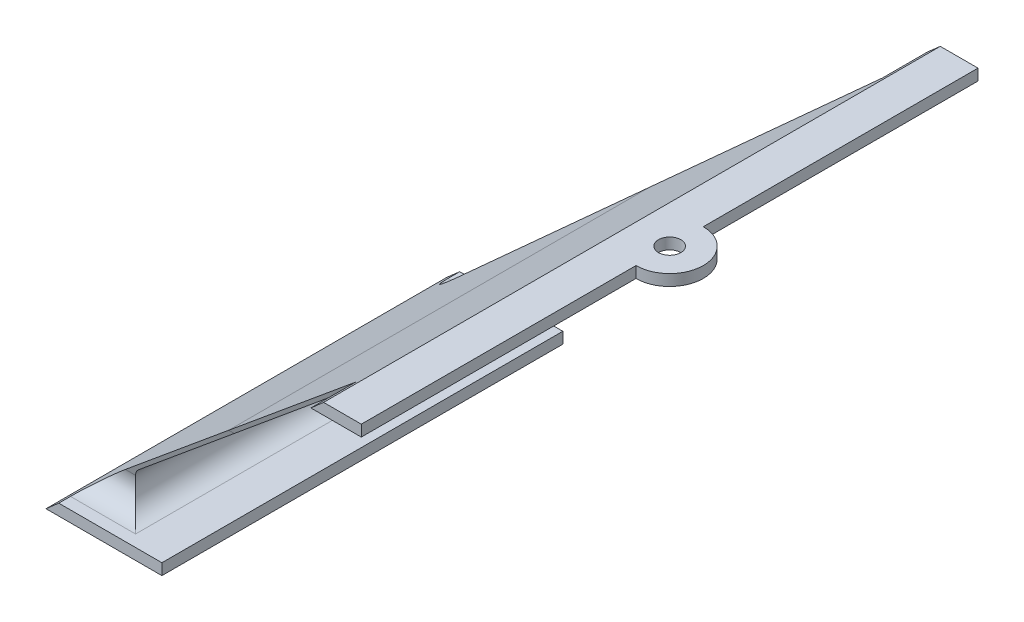
ISO-10303-21;
HEADER;
FILE_DESCRIPTION(('STEP AP214'),'2;1');
FILE_NAME('part.step','',(''),(''),'','','');
FILE_SCHEMA(('AUTOMOTIVE_DESIGN { 1 0 10303 214 1 1 1 1 }'));
ENDSEC;
DATA;
#1=APPLICATION_CONTEXT('core data for automotive mechanical design processes');
#2=APPLICATION_PROTOCOL_DEFINITION('international standard','automotive_design',2000,#1);
#3=PRODUCT_CONTEXT('',#1,'mechanical');
#4=PRODUCT('Part','Part','',(#3));
#5=PRODUCT_RELATED_PRODUCT_CATEGORY('part','',(#4));
#6=PRODUCT_DEFINITION_FORMATION('','',#4);
#7=PRODUCT_DEFINITION_CONTEXT('part definition',#1,'design');
#8=PRODUCT_DEFINITION('design','',#6,#7);
#9=PRODUCT_DEFINITION_SHAPE('','',#8);
#10=(LENGTH_UNIT() NAMED_UNIT(*) SI_UNIT(.MILLI.,.METRE.));
#11=(NAMED_UNIT(*) PLANE_ANGLE_UNIT() SI_UNIT($,.RADIAN.));
#12=(NAMED_UNIT(*) SI_UNIT($,.STERADIAN.) SOLID_ANGLE_UNIT());
#13=UNCERTAINTY_MEASURE_WITH_UNIT(LENGTH_MEASURE(1.E-05),#10,'distance_accuracy_value','');
#14=(GEOMETRIC_REPRESENTATION_CONTEXT(3) GLOBAL_UNCERTAINTY_ASSIGNED_CONTEXT((#13)) GLOBAL_UNIT_ASSIGNED_CONTEXT((#10,
#11,#12)) REPRESENTATION_CONTEXT('',''));
#15=CARTESIAN_POINT('',(0.,0.,0.));
#16=DIRECTION('',(0.,0.,1.));
#17=DIRECTION('',(1.,0.,0.));
#18=AXIS2_PLACEMENT_3D('',#15,#16,#17);
#19=CARTESIAN_POINT('',(114.106988188976,-70.5249999999999,141.072171653543));
#20=DIRECTION('',(-0.660159046311805,0.751125844031936,0.));
#21=DIRECTION('',(-0.751125844031936,-0.660159046311805,0.));
#22=AXIS2_PLACEMENT_3D('',#19,#20,#21);
#23=PLANE('',#22);
#24=DIRECTION('',(-0.733434694729322,-0.644610423741342,-0.215756692066117));
#25=VECTOR('',#24,1.);
#26=CARTESIAN_POINT('',(63.7448594836928,-114.787908965889,126.256992643134));
#27=LINE('',#26,#25);
#28=CARTESIAN_POINT('',(194.35,0.,164.6775));
#29=VERTEX_POINT('',#28);
#30=CARTESIAN_POINT('',(114.106988188976,-70.5249999999999,141.072171653543));
#31=VERTEX_POINT('',#30);
#32=EDGE_CURVE('E14',#29,#31,#27,.T.);
#33=ORIENTED_EDGE('',*,*,#32,.F.);
#34=DIRECTION('',(0.,0.,1.));
#35=VECTOR('',#34,1.);
#36=CARTESIAN_POINT('',(194.35,0.,-90.2725000000001));
#37=LINE('',#36,#35);
#38=CARTESIAN_POINT('',(194.35,0.,184.6775));
#39=VERTEX_POINT('',#38);
#40=EDGE_CURVE('E86',#29,#39,#37,.T.);
#41=ORIENTED_EDGE('',*,*,#40,.T.);
#42=DIRECTION('',(0.751125844031936,0.660159046311805,0.));
#43=VECTOR('',#42,1.);
#44=CARTESIAN_POINT('',(87.1789795794293,-94.19183109628,184.6775));
#45=LINE('',#44,#43);
#46=CARTESIAN_POINT('',(200.038976377953,5.,184.6775));
#47=VERTEX_POINT('',#46);
#48=EDGE_CURVE('E176',#39,#47,#45,.T.);
#49=ORIENTED_EDGE('',*,*,#48,.T.);
#50=DIRECTION('',(0.,0.,1.));
#51=VECTOR('',#50,1.);
#52=CARTESIAN_POINT('',(200.038976377953,5.,0.));
#53=LINE('',#52,#51);
#54=CARTESIAN_POINT('',(200.038976377953,5.,-90.2725));
#55=VERTEX_POINT('',#54);
#56=EDGE_CURVE('E214',#55,#47,#53,.T.);
#57=ORIENTED_EDGE('',*,*,#56,.F.);
#58=DIRECTION('',(0.751125844031936,0.660159046311805,0.));
#59=VECTOR('',#58,1.);
#60=CARTESIAN_POINT('',(87.1789795794294,-94.1918310962799,-90.2725));
#61=LINE('',#60,#59);
#62=CARTESIAN_POINT('',(194.35,0.,-90.2725000000001));
#63=VERTEX_POINT('',#62);
#64=EDGE_CURVE('E178',#63,#55,#61,.T.);
#65=ORIENTED_EDGE('',*,*,#64,.F.);
#66=CARTESIAN_POINT('',(194.35,0.,-70.2725));
#67=VERTEX_POINT('',#66);
#68=EDGE_CURVE('E179',#63,#67,#37,.T.);
#69=ORIENTED_EDGE('',*,*,#68,.T.);
#70=DIRECTION('',(-0.733434694729322,-0.644610423741342,0.215756692066118));
#71=VECTOR('',#70,1.);
#72=CARTESIAN_POINT('',(78.6838317749874,-101.658154772156,-36.2466350940566));
#73=LINE('',#72,#71);
#74=CARTESIAN_POINT('',(114.106988188976,-70.5249999999999,-46.6671716535433));
#75=VERTEX_POINT('',#74);
#76=EDGE_CURVE('E92',#67,#75,#73,.T.);
#77=ORIENTED_EDGE('',*,*,#76,.T.);
#78=DIRECTION('',(0.,0.,-1.));
#79=VECTOR('',#78,1.);
#80=CARTESIAN_POINT('',(114.106988188976,-70.5249999999999,392.1275));
#81=LINE('',#80,#79);
#82=EDGE_CURVE('E100',#31,#75,#81,.T.);
#83=ORIENTED_EDGE('',*,*,#82,.F.);
#84=EDGE_LOOP('',(#33,#41,#49,#57,#65,#69,#77,#83));
#85=FACE_BOUND('',#84,.T.);
#86=ADVANCED_FACE('F82',(#85),#23,.T.);
#87=CARTESIAN_POINT('',(0.,-70.5249999999999,0.));
#88=DIRECTION('',(0.,1.,0.));
#89=DIRECTION('',(0.,0.,1.));
#90=AXIS2_PLACEMENT_3D('',#87,#88,#89);
#91=PLANE('',#90);
#92=ORIENTED_EDGE('',*,*,#82,.T.);
#93=DIRECTION('',(-1.,0.,0.));
#94=VECTOR('',#93,1.);
#95=CARTESIAN_POINT('',(0.,-70.5249999999999,-46.6671716535434));
#96=LINE('',#95,#94);
#97=CARTESIAN_POINT('',(116.606988188976,-70.5249999999999,-46.6671716535433));
#98=VERTEX_POINT('',#97);
#99=EDGE_CURVE('E203',#98,#75,#96,.T.);
#100=ORIENTED_EDGE('',*,*,#99,.F.);
#101=DIRECTION('',(0.,0.,-1.));
#102=VECTOR('',#101,1.);
#103=CARTESIAN_POINT('',(116.606988188976,-70.5249999999999,0.));
#104=LINE('',#103,#102);
#105=CARTESIAN_POINT('',(116.606988188976,-70.525,141.072171653543));
#106=VERTEX_POINT('',#105);
#107=EDGE_CURVE('E340',#106,#98,#104,.T.);
#108=ORIENTED_EDGE('',*,*,#107,.F.);
#109=DIRECTION('',(-1.,0.,0.));
#110=VECTOR('',#109,1.);
#111=CARTESIAN_POINT('',(0.,-70.5249999999999,141.072171653543));
#112=LINE('',#111,#110);
#113=EDGE_CURVE('E337',#106,#31,#112,.T.);
#114=ORIENTED_EDGE('',*,*,#113,.T.);
#115=EDGE_LOOP('',(#92,#100,#108,#114));
#116=FACE_BOUND('',#115,.T.);
#117=ADVANCED_FACE('F300',(#116),#91,.F.);
#118=CARTESIAN_POINT('',(0.,-21.1512430220413,-63.1929957607801));
#119=DIRECTION('',(0.,0.317401314466158,0.948291308393763));
#120=DIRECTION('',(0.,-0.948291308393763,0.317401314466158));
#121=AXIS2_PLACEMENT_3D('',#118,#119,#120);
#122=PLANE('',#121);
#123=ORIENTED_EDGE('',*,*,#76,.F.);
#124=DIRECTION('',(-1.,0.,0.));
#125=VECTOR('',#124,1.);
#126=CARTESIAN_POINT('',(-63.5,0.,-70.2725000000001));
#127=LINE('',#126,#125);
#128=CARTESIAN_POINT('',(196.85,0.,-70.2725));
#129=VERTEX_POINT('',#128);
#130=EDGE_CURVE('E193',#129,#67,#127,.T.);
#131=ORIENTED_EDGE('',*,*,#130,.F.);
#132=DIRECTION('',(-0.733434694729322,-0.644610423741342,0.215756692066118));
#133=VECTOR('',#132,1.);
#134=CARTESIAN_POINT('',(196.85,0.,-70.2725));
#135=LINE('',#134,#133);
#136=EDGE_CURVE('E200',#129,#98,#135,.T.);
#137=ORIENTED_EDGE('',*,*,#136,.T.);
#138=ORIENTED_EDGE('',*,*,#99,.T.);
#139=EDGE_LOOP('',(#123,#131,#137,#138));
#140=FACE_BOUND('',#139,.T.);
#141=ADVANCED_FACE('F202',(#140),#122,.F.);
#142=CARTESIAN_POINT('',(85.7891918912163,-97.6105372305572,0.));
#143=DIRECTION('',(-0.660159046311805,0.751125844031936,0.));
#144=DIRECTION('',(-0.751125844031936,-0.660159046311805,0.));
#145=AXIS2_PLACEMENT_3D('',#142,#143,#144);
#146=PLANE('',#145);
#147=DIRECTION('',(-0.733434694729322,-0.644610423741342,-0.215756692066118));
#148=VECTOR('',#147,1.);
#149=CARTESIAN_POINT('',(196.85,0.,164.6775));
#150=LINE('',#149,#148);
#151=CARTESIAN_POINT('',(196.85,0.,164.6775));
#152=VERTEX_POINT('',#151);
#153=EDGE_CURVE('E324',#152,#106,#150,.T.);
#154=ORIENTED_EDGE('',*,*,#153,.T.);
#155=ORIENTED_EDGE('',*,*,#107,.T.);
#156=ORIENTED_EDGE('',*,*,#136,.F.);
#157=DIRECTION('',(0.,0.,-1.));
#158=VECTOR('',#157,1.);
#159=CARTESIAN_POINT('',(196.85,0.,-70.2725));
#160=LINE('',#159,#158);
#161=EDGE_CURVE('E195',#152,#129,#160,.T.);
#162=ORIENTED_EDGE('',*,*,#161,.F.);
#163=EDGE_LOOP('',(#154,#155,#156,#162));
#164=FACE_BOUND('',#163,.T.);
#165=ADVANCED_FACE('F310',(#164),#146,.F.);
#166=CARTESIAN_POINT('',(0.,-49.5661008611077,148.087296729102));
#167=DIRECTION('',(0.,-0.317401314466157,0.948291308393763));
#168=DIRECTION('',(0.,-0.948291308393763,-0.317401314466157));
#169=AXIS2_PLACEMENT_3D('',#166,#167,#168);
#170=PLANE('',#169);
#171=DIRECTION('',(1.,0.,0.));
#172=VECTOR('',#171,1.);
#173=CARTESIAN_POINT('',(-63.5,0.,164.6775));
#174=LINE('',#173,#172);
#175=EDGE_CURVE('E268',#29,#152,#174,.T.);
#176=ORIENTED_EDGE('',*,*,#175,.F.);
#177=ORIENTED_EDGE('',*,*,#32,.T.);
#178=ORIENTED_EDGE('',*,*,#113,.F.);
#179=ORIENTED_EDGE('',*,*,#153,.F.);
#180=EDGE_LOOP('',(#176,#177,#178,#179));
#181=FACE_BOUND('',#180,.T.);
#182=ADVANCED_FACE('F312',(#181),#170,.T.);
#183=CARTESIAN_POINT('',(-1.19463333478565E-13,5.,184.6775));
#184=DIRECTION('',(0.,0.,-1.));
#185=DIRECTION('',(-1.,0.,0.));
#186=AXIS2_PLACEMENT_3D('',#183,#184,#185);
#187=PLANE('',#186);
#188=ORIENTED_EDGE('',*,*,#48,.F.);
#189=DIRECTION('',(1.,0.,0.));
#190=VECTOR('',#189,1.);
#191=CARTESIAN_POINT('',(-1.19463333478565E-13,0.,184.6775));
#192=LINE('',#191,#190);
#193=CARTESIAN_POINT('',(216.85,0.,184.6775));
#194=VERTEX_POINT('',#193);
#195=EDGE_CURVE('E160',#39,#194,#192,.T.);
#196=ORIENTED_EDGE('',*,*,#195,.T.);
#197=DIRECTION('',(0.,-1.,0.));
#198=VECTOR('',#197,1.);
#199=CARTESIAN_POINT('',(216.85,5.,184.6775));
#200=LINE('',#199,#198);
#201=CARTESIAN_POINT('',(216.85,5.,184.6775));
#202=VERTEX_POINT('',#201);
#203=EDGE_CURVE('E266',#202,#194,#200,.T.);
#204=ORIENTED_EDGE('',*,*,#203,.F.);
#205=DIRECTION('',(1.,0.,0.));
#206=VECTOR('',#205,1.);
#207=CARTESIAN_POINT('',(-1.19463333478565E-13,5.,184.6775));
#208=LINE('',#207,#206);
#209=EDGE_CURVE('E177',#47,#202,#208,.T.);
#210=ORIENTED_EDGE('',*,*,#209,.F.);
#211=EDGE_LOOP('',(#188,#196,#204,#210));
#212=FACE_BOUND('',#211,.T.);
#213=ADVANCED_FACE('F84',(#212),#187,.F.);
#214=CARTESIAN_POINT('',(216.85,5.,0.));
#215=DIRECTION('',(1.,0.,0.));
#216=DIRECTION('',(0.,0.,-1.));
#217=AXIS2_PLACEMENT_3D('',#214,#215,#216);
#218=PLANE('',#217);
#219=DIRECTION('',(0.,1.,0.));
#220=VECTOR('',#219,1.);
#221=CARTESIAN_POINT('',(216.85,-33.5410196624969,62.2025));
#222=LINE('',#221,#220);
#223=CARTESIAN_POINT('',(216.85,0.,62.2025));
#224=VERTEX_POINT('',#223);
#225=CARTESIAN_POINT('',(216.85,5.,62.2025));
#226=VERTEX_POINT('',#225);
#227=EDGE_CURVE('E246',#224,#226,#222,.T.);
#228=ORIENTED_EDGE('',*,*,#227,.T.);
#229=DIRECTION('',(0.,0.,1.));
#230=VECTOR('',#229,1.);
#231=CARTESIAN_POINT('',(216.85,5.,0.));
#232=LINE('',#231,#230);
#233=EDGE_CURVE('E219',#226,#202,#232,.T.);
#234=ORIENTED_EDGE('',*,*,#233,.T.);
#235=ORIENTED_EDGE('',*,*,#203,.T.);
#236=DIRECTION('',(0.,0.,1.));
#237=VECTOR('',#236,1.);
#238=CARTESIAN_POINT('',(216.85,0.,0.));
#239=LINE('',#238,#237);
#240=EDGE_CURVE('E167',#224,#194,#239,.T.);
#241=ORIENTED_EDGE('',*,*,#240,.F.);
#242=EDGE_LOOP('',(#228,#234,#235,#241));
#243=FACE_BOUND('',#242,.T.);
#244=ADVANCED_FACE('F289',(#243),#218,.T.);
#245=CARTESIAN_POINT('',(216.85,-33.5410196624969,47.2025));
#246=DIRECTION('',(0.,1.,0.));
#247=DIRECTION('',(0.,0.,1.));
#248=AXIS2_PLACEMENT_3D('',#245,#246,#247);
#249=CYLINDRICAL_SURFACE('',#248,15.);
#250=CARTESIAN_POINT('',(216.85,0.,47.2025));
#251=DIRECTION('',(0.,1.,0.));
#252=DIRECTION('',(0.,0.,1.));
#253=AXIS2_PLACEMENT_3D('',#250,#251,#252);
#254=CIRCLE('',#253,15.);
#255=CARTESIAN_POINT('',(216.85,0.,32.2025));
#256=VERTEX_POINT('',#255);
#257=EDGE_CURVE('E212',#256,#224,#254,.F.);
#258=ORIENTED_EDGE('',*,*,#257,.F.);
#259=DIRECTION('',(0.,1.,0.));
#260=VECTOR('',#259,1.);
#261=CARTESIAN_POINT('',(216.85,-33.5410196624969,32.2025));
#262=LINE('',#261,#260);
#263=CARTESIAN_POINT('',(216.85,5.,32.2025));
#264=VERTEX_POINT('',#263);
#265=EDGE_CURVE('E243',#256,#264,#262,.T.);
#266=ORIENTED_EDGE('',*,*,#265,.T.);
#267=CARTESIAN_POINT('',(216.85,5.,47.2025));
#268=DIRECTION('',(0.,1.,0.));
#269=DIRECTION('',(0.,0.,1.));
#270=AXIS2_PLACEMENT_3D('',#267,#268,#269);
#271=CIRCLE('',#270,15.);
#272=EDGE_CURVE('E205',#226,#264,#271,.T.);
#273=ORIENTED_EDGE('',*,*,#272,.F.);
#274=ORIENTED_EDGE('',*,*,#227,.F.);
#275=EDGE_LOOP('',(#258,#266,#273,#274));
#276=FACE_BOUND('',#275,.T.);
#277=ADVANCED_FACE('F291',(#276),#249,.T.);
#278=ORIENTED_EDGE('',*,*,#265,.F.);
#279=CARTESIAN_POINT('',(216.85,0.,-90.2725));
#280=VERTEX_POINT('',#279);
#281=EDGE_CURVE('E221',#280,#256,#239,.T.);
#282=ORIENTED_EDGE('',*,*,#281,.F.);
#283=DIRECTION('',(0.,-1.,0.));
#284=VECTOR('',#283,1.);
#285=CARTESIAN_POINT('',(216.85,5.,-90.2725));
#286=LINE('',#285,#284);
#287=CARTESIAN_POINT('',(216.85,5.,-90.2725));
#288=VERTEX_POINT('',#287);
#289=EDGE_CURVE('E230',#288,#280,#286,.T.);
#290=ORIENTED_EDGE('',*,*,#289,.F.);
#291=EDGE_CURVE('E235',#288,#264,#232,.T.);
#292=ORIENTED_EDGE('',*,*,#291,.T.);
#293=EDGE_LOOP('',(#278,#282,#290,#292));
#294=FACE_BOUND('',#293,.T.);
#295=ADVANCED_FACE('F264',(#294),#218,.T.);
#296=CARTESIAN_POINT('',(0.,5.,-90.2725000000001));
#297=DIRECTION('',(0.,0.,-1.));
#298=DIRECTION('',(-1.,0.,0.));
#299=AXIS2_PLACEMENT_3D('',#296,#297,#298);
#300=PLANE('',#299);
#301=DIRECTION('',(1.,0.,0.));
#302=VECTOR('',#301,1.);
#303=CARTESIAN_POINT('',(0.,0.,-90.2725000000001));
#304=LINE('',#303,#302);
#305=EDGE_CURVE('E172',#63,#280,#304,.T.);
#306=ORIENTED_EDGE('',*,*,#305,.F.);
#307=ORIENTED_EDGE('',*,*,#64,.T.);
#308=DIRECTION('',(1.,0.,0.));
#309=VECTOR('',#308,1.);
#310=CARTESIAN_POINT('',(0.,5.,-90.2725000000001));
#311=LINE('',#310,#309);
#312=EDGE_CURVE('E218',#55,#288,#311,.T.);
#313=ORIENTED_EDGE('',*,*,#312,.T.);
#314=ORIENTED_EDGE('',*,*,#289,.T.);
#315=EDGE_LOOP('',(#306,#307,#313,#314));
#316=FACE_BOUND('',#315,.T.);
#317=ADVANCED_FACE('F297',(#316),#300,.T.);
#318=CARTESIAN_POINT('',(216.85,-33.5410196624969,47.2025));
#319=DIRECTION('',(0.,1.,0.));
#320=DIRECTION('',(0.,0.,1.));
#321=AXIS2_PLACEMENT_3D('',#318,#319,#320);
#322=CYLINDRICAL_SURFACE('',#321,4.99999999999999);
#323=CARTESIAN_POINT('',(216.85,5.,47.2025));
#324=DIRECTION('',(0.,1.,0.));
#325=DIRECTION('',(0.,0.,1.));
#326=AXIS2_PLACEMENT_3D('',#323,#324,#325);
#327=CIRCLE('',#326,4.99999999999999);
#328=CARTESIAN_POINT('',(216.85,5.,52.2025));
#329=VERTEX_POINT('',#328);
#330=EDGE_CURVE('E209',#329,#329,#327,.T.);
#331=ORIENTED_EDGE('',*,*,#330,.T.);
#332=EDGE_LOOP('',(#331));
#333=FACE_BOUND('',#332,.T.);
#334=CARTESIAN_POINT('',(216.85,0.,47.2025));
#335=DIRECTION('',(0.,1.,0.));
#336=DIRECTION('',(0.,0.,1.));
#337=AXIS2_PLACEMENT_3D('',#334,#335,#336);
#338=CIRCLE('',#337,4.99999999999999);
#339=CARTESIAN_POINT('',(216.85,0.,52.2025));
#340=VERTEX_POINT('',#339);
#341=EDGE_CURVE('E239',#340,#340,#338,.F.);
#342=ORIENTED_EDGE('',*,*,#341,.T.);
#343=EDGE_LOOP('',(#342));
#344=FACE_BOUND('',#343,.T.);
#345=ADVANCED_FACE('F254',(#333,#344),#322,.F.);
#346=CARTESIAN_POINT('',(0.,0.,0.));
#347=DIRECTION('',(0.,1.,0.));
#348=DIRECTION('',(0.,0.,1.));
#349=AXIS2_PLACEMENT_3D('',#346,#347,#348);
#350=PLANE('',#349);
#351=ORIENTED_EDGE('',*,*,#341,.F.);
#352=EDGE_LOOP('',(#351));
#353=FACE_BOUND('',#352,.T.);
#354=ORIENTED_EDGE('',*,*,#68,.F.);
#355=ORIENTED_EDGE('',*,*,#305,.T.);
#356=ORIENTED_EDGE('',*,*,#281,.T.);
#357=ORIENTED_EDGE('',*,*,#257,.T.);
#358=ORIENTED_EDGE('',*,*,#240,.T.);
#359=ORIENTED_EDGE('',*,*,#195,.F.);
#360=ORIENTED_EDGE('',*,*,#40,.F.);
#361=ORIENTED_EDGE('',*,*,#175,.T.);
#362=ORIENTED_EDGE('',*,*,#161,.T.);
#363=ORIENTED_EDGE('',*,*,#130,.T.);
#364=EDGE_LOOP('',(#354,#355,#356,#357,#358,#359,#360,#361,#362,#363));
#365=FACE_BOUND('',#364,.T.);
#366=ADVANCED_FACE('F163',(#353,#365),#350,.F.);
#367=CARTESIAN_POINT('',(0.,5.,0.));
#368=DIRECTION('',(0.,1.,0.));
#369=DIRECTION('',(0.,0.,1.));
#370=AXIS2_PLACEMENT_3D('',#367,#368,#369);
#371=PLANE('',#370);
#372=ORIENTED_EDGE('',*,*,#330,.F.);
#373=EDGE_LOOP('',(#372));
#374=FACE_BOUND('',#373,.T.);
#375=ORIENTED_EDGE('',*,*,#312,.F.);
#376=ORIENTED_EDGE('',*,*,#56,.T.);
#377=ORIENTED_EDGE('',*,*,#209,.T.);
#378=ORIENTED_EDGE('',*,*,#233,.F.);
#379=ORIENTED_EDGE('',*,*,#272,.T.);
#380=ORIENTED_EDGE('',*,*,#291,.F.);
#381=EDGE_LOOP('',(#375,#376,#377,#378,#379,#380));
#382=FACE_BOUND('',#381,.T.);
#383=ADVANCED_FACE('F257',(#374,#382),#371,.T.);
#384=CLOSED_SHELL('',(#86,#117,#141,#165,#182,#213,#244,#277,#295,#317,#345,#366,#383));
#385=MANIFOLD_SOLID_BREP('B2',#384);
#386=CARTESIAN_POINT('',(0.,-70.5249999999999,0.));
#387=DIRECTION('',(0.,1.,0.));
#388=DIRECTION('',(0.,0.,1.));
#389=AXIS2_PLACEMENT_3D('',#386,#387,#388);
#390=PLANE('',#389);
#391=DIRECTION('',(-1.,0.,0.));
#392=VECTOR('',#391,1.);
#393=CARTESIAN_POINT('',(0.,-70.5249999999999,-46.6671716535434));
#394=LINE('',#393,#392);
#395=CARTESIAN_POINT('',(116.606988188976,-70.5249999999999,-46.6671716535433));
#396=VERTEX_POINT('',#395);
#397=CARTESIAN_POINT('',(114.106988188976,-70.5249999999999,-46.6671716535433));
#398=VERTEX_POINT('',#397);
#399=EDGE_CURVE('E646',#396,#398,#394,.T.);
#400=ORIENTED_EDGE('',*,*,#399,.T.);
#401=DIRECTION('',(0.,0.,-1.));
#402=VECTOR('',#401,1.);
#403=CARTESIAN_POINT('',(114.106988188976,-70.5249999999999,392.1275));
#404=LINE('',#403,#402);
#405=CARTESIAN_POINT('',(114.106988188976,-70.5249999999999,141.072171653543));
#406=VERTEX_POINT('',#405);
#407=EDGE_CURVE('E645',#406,#398,#404,.T.);
#408=ORIENTED_EDGE('',*,*,#407,.F.);
#409=DIRECTION('',(-1.,0.,0.));
#410=VECTOR('',#409,1.);
#411=CARTESIAN_POINT('',(0.,-70.5249999999999,141.072171653543));
#412=LINE('',#411,#410);
#413=CARTESIAN_POINT('',(116.606988188976,-70.525,141.072171653543));
#414=VERTEX_POINT('',#413);
#415=EDGE_CURVE('E641',#414,#406,#412,.T.);
#416=ORIENTED_EDGE('',*,*,#415,.F.);
#417=DIRECTION('',(0.,0.,-1.));
#418=VECTOR('',#417,1.);
#419=CARTESIAN_POINT('',(116.606988188976,-70.5249999999999,0.));
#420=LINE('',#419,#418);
#421=EDGE_CURVE('E650',#414,#396,#420,.T.);
#422=ORIENTED_EDGE('',*,*,#421,.T.);
#423=EDGE_LOOP('',(#400,#408,#416,#422));
#424=FACE_BOUND('',#423,.T.);
#425=ADVANCED_FACE('F492',(#424),#390,.T.);
#426=CARTESIAN_POINT('',(0.,-141.05,0.));
#427=DIRECTION('',(0.,1.,0.));
#428=DIRECTION('',(0.,0.,1.));
#429=AXIS2_PLACEMENT_3D('',#426,#427,#428);
#430=PLANE('',#429);
#431=DIRECTION('',(-1.,0.,0.));
#432=VECTOR('',#431,1.);
#433=CARTESIAN_POINT('',(0.,-141.05,-42.1725000000001));
#434=LINE('',#433,#432);
#435=CARTESIAN_POINT('',(79.85,-141.05,-42.1725000000001));
#436=VERTEX_POINT('',#435);
#437=CARTESIAN_POINT('',(33.8639763779527,-141.05,-42.1725000000001));
#438=VERTEX_POINT('',#437);
#439=EDGE_CURVE('E626',#436,#438,#434,.T.);
#440=ORIENTED_EDGE('',*,*,#439,.T.);
#441=DIRECTION('',(0.,0.,1.));
#442=VECTOR('',#441,1.);
#443=CARTESIAN_POINT('',(33.8639763779527,-141.05,0.));
#444=LINE('',#443,#442);
#445=CARTESIAN_POINT('',(33.8639763779527,-141.05,-36.9542126961682));
#446=VERTEX_POINT('',#445);
#447=EDGE_CURVE('E594',#438,#446,#444,.T.);
#448=ORIENTED_EDGE('',*,*,#447,.T.);
#449=DIRECTION('',(-1.,0.,0.));
#450=VECTOR('',#449,1.);
#451=CARTESIAN_POINT('',(0.,-141.05,-36.9542126961682));
#452=LINE('',#451,#450);
#453=CARTESIAN_POINT('',(62.8897939641114,-141.05,-36.9542126961682));
#454=VERTEX_POINT('',#453);
#455=EDGE_CURVE('E682',#446,#454,#452,.F.);
#456=ORIENTED_EDGE('',*,*,#455,.T.);
#457=DIRECTION('',(0.,0.,-1.));
#458=VECTOR('',#457,1.);
#459=CARTESIAN_POINT('',(62.8897939641114,-141.05,0.));
#460=LINE('',#459,#458);
#461=CARTESIAN_POINT('',(62.8897939641114,-141.05,131.359212696168));
#462=VERTEX_POINT('',#461);
#463=EDGE_CURVE('E685',#454,#462,#460,.F.);
#464=ORIENTED_EDGE('',*,*,#463,.T.);
#465=DIRECTION('',(-1.,0.,0.));
#466=VECTOR('',#465,1.);
#467=CARTESIAN_POINT('',(-25.6661502909962,-141.05,131.359212696168));
#468=LINE('',#467,#466);
#469=CARTESIAN_POINT('',(33.8639763779527,-141.05,131.359212696168));
#470=VERTEX_POINT('',#469);
#471=EDGE_CURVE('E688',#462,#470,#468,.T.);
#472=ORIENTED_EDGE('',*,*,#471,.T.);
#473=CARTESIAN_POINT('',(33.8639763779527,-141.05,136.5775));
#474=VERTEX_POINT('',#473);
#475=EDGE_CURVE('E764',#470,#474,#444,.T.);
#476=ORIENTED_EDGE('',*,*,#475,.T.);
#477=DIRECTION('',(1.,0.,0.));
#478=VECTOR('',#477,1.);
#479=CARTESIAN_POINT('',(0.,-141.05,136.5775));
#480=LINE('',#479,#478);
#481=CARTESIAN_POINT('',(79.85,-141.05,136.5775));
#482=VERTEX_POINT('',#481);
#483=EDGE_CURVE('E615',#474,#482,#480,.T.);
#484=ORIENTED_EDGE('',*,*,#483,.T.);
#485=DIRECTION('',(0.,0.,-1.));
#486=VECTOR('',#485,1.);
#487=CARTESIAN_POINT('',(79.85,-141.05,0.));
#488=LINE('',#487,#486);
#489=EDGE_CURVE('E526',#482,#436,#488,.T.);
#490=ORIENTED_EDGE('',*,*,#489,.T.);
#491=EDGE_LOOP('',(#440,#448,#456,#464,#472,#476,#484,#490));
#492=FACE_BOUND('',#491,.T.);
#493=ADVANCED_FACE('F722',(#492),#430,.T.);
#494=CARTESIAN_POINT('',(0.,-131.05,-36.9542126961682));
#495=DIRECTION('',(-1.,0.,0.));
#496=DIRECTION('',(0.,0.,1.));
#497=AXIS2_PLACEMENT_3D('',#494,#495,#496);
#498=CYLINDRICAL_SURFACE('',#497,10.);
#499=CARTESIAN_POINT('',(45.2419291338583,-131.05,-36.9542126961682));
#500=DIRECTION('',(-0.660159046311805,0.751125844031936,0.));
#501=DIRECTION('',(-0.751125844031936,-0.660159046311805,0.));
#502=AXIS2_PLACEMENT_3D('',#499,#500,#501);
#503=ELLIPSE('',#502,15.1478648302531,10.);
#504=CARTESIAN_POINT('',(48.8533062945165,-127.875986855338,-27.4712996122306));
#505=VERTEX_POINT('',#504);
#506=EDGE_CURVE('E756',#505,#446,#503,.F.);
#507=ORIENTED_EDGE('',*,*,#506,.F.);
#508=DIRECTION('',(-1.,0.,0.));
#509=VECTOR('',#508,1.);
#510=CARTESIAN_POINT('',(0.,-127.875986855338,-27.4712996122306));
#511=LINE('',#510,#509);
#512=CARTESIAN_POINT('',(53.4068808801737,-127.875986855338,-27.4712996122306));
#513=VERTEX_POINT('',#512);
#514=EDGE_CURVE('E692',#513,#505,#511,.T.);
#515=ORIENTED_EDGE('',*,*,#514,.F.);
#516=CARTESIAN_POINT('',(62.8897939641114,-131.05,-36.9542126961682));
#517=DIRECTION('',(-0.707106781186547,0.,-0.707106781186548));
#518=DIRECTION('',(0.707106781186547,0.,-0.707106781186547));
#519=AXIS2_PLACEMENT_3D('',#516,#517,#518);
#520=ELLIPSE('',#519,14.1421356237309,10.);
#521=EDGE_CURVE('E80',#513,#454,#520,.F.);
#522=ORIENTED_EDGE('',*,*,#521,.T.);
#523=ORIENTED_EDGE('',*,*,#455,.F.);
#524=EDGE_LOOP('',(#507,#515,#522,#523));
#525=FACE_BOUND('',#524,.T.);
#526=ADVANCED_FACE('F710',(#525),#498,.F.);
#527=CARTESIAN_POINT('',(0.,-21.1512430220413,-63.1929957607801));
#528=DIRECTION('',(0.,0.317401314466158,0.948291308393763));
#529=DIRECTION('',(0.,-0.948291308393763,0.317401314466158));
#530=AXIS2_PLACEMENT_3D('',#527,#528,#529);
#531=PLANE('',#530);
#532=DIRECTION('',(-0.733434694729322,-0.644610423741342,0.215756692066118));
#533=VECTOR('',#532,1.);
#534=CARTESIAN_POINT('',(78.6838317749874,-101.658154772156,-36.2466350940566));
#535=LINE('',#534,#533);
#536=EDGE_CURVE('E654',#398,#505,#535,.T.);
#537=ORIENTED_EDGE('',*,*,#536,.F.);
#538=ORIENTED_EDGE('',*,*,#399,.F.);
#539=DIRECTION('',(-0.733434694729322,-0.644610423741342,0.215756692066118));
#540=VECTOR('',#539,1.);
#541=CARTESIAN_POINT('',(196.85,0.,-70.2725));
#542=LINE('',#541,#540);
#543=CARTESIAN_POINT('',(56.2882035009933,-123.538741559681,-28.9230131793788));
#544=VERTEX_POINT('',#543);
#545=EDGE_CURVE('E747',#396,#544,#542,.T.);
#546=ORIENTED_EDGE('',*,*,#545,.T.);
#547=CARTESIAN_POINT('',(62.8897939641114,-131.05,-26.4089299212599));
#548=DIRECTION('',(0.,0.317401314466158,0.948291308393763));
#549=DIRECTION('',(0.,0.948291308393763,-0.317401314466158));
#550=AXIS2_PLACEMENT_3D('',#547,#548,#549);
#551=ELLIPSE('',#550,10.5452827749083,10.);
#552=EDGE_CURVE('E671',#544,#513,#551,.T.);
#553=ORIENTED_EDGE('',*,*,#552,.T.);
#554=ORIENTED_EDGE('',*,*,#514,.T.);
#555=EDGE_LOOP('',(#537,#538,#546,#553,#554));
#556=FACE_BOUND('',#555,.T.);
#557=ADVANCED_FACE('F728',(#556),#531,.F.);
#558=CARTESIAN_POINT('',(0.,-131.05,131.359212696168));
#559=DIRECTION('',(1.,0.,0.));
#560=DIRECTION('',(0.,0.,-1.));
#561=AXIS2_PLACEMENT_3D('',#558,#559,#560);
#562=CYLINDRICAL_SURFACE('',#561,10.);
#563=CARTESIAN_POINT('',(45.2419291338583,-131.05,131.359212696168));
#564=DIRECTION('',(-0.660159046311805,0.751125844031936,0.));
#565=DIRECTION('',(0.751125844031936,0.660159046311805,0.));
#566=AXIS2_PLACEMENT_3D('',#563,#564,#565);
#567=ELLIPSE('',#566,15.1478648302531,10.);
#568=CARTESIAN_POINT('',(48.8533062945165,-127.875986855338,121.87629961223));
#569=VERTEX_POINT('',#568);
#570=EDGE_CURVE('E768',#470,#569,#567,.F.);
#571=ORIENTED_EDGE('',*,*,#570,.F.);
#572=ORIENTED_EDGE('',*,*,#471,.F.);
#573=CARTESIAN_POINT('',(62.8897939641114,-131.05,131.359212696168));
#574=DIRECTION('',(0.707106781186547,0.,-0.707106781186548));
#575=DIRECTION('',(0.707106781186547,0.,0.707106781186547));
#576=AXIS2_PLACEMENT_3D('',#573,#574,#575);
#577=ELLIPSE('',#576,14.142135623731,10.);
#578=CARTESIAN_POINT('',(53.4068808801737,-127.875986855338,121.87629961223));
#579=VERTEX_POINT('',#578);
#580=EDGE_CURVE('E505',#579,#462,#577,.F.);
#581=ORIENTED_EDGE('',*,*,#580,.F.);
#582=DIRECTION('',(-1.,0.,0.));
#583=VECTOR('',#582,1.);
#584=CARTESIAN_POINT('',(36.3639763779528,-127.875986855338,121.87629961223));
#585=LINE('',#584,#583);
#586=EDGE_CURVE('E675',#569,#579,#585,.F.);
#587=ORIENTED_EDGE('',*,*,#586,.F.);
#588=EDGE_LOOP('',(#571,#572,#581,#587));
#589=FACE_BOUND('',#588,.T.);
#590=ADVANCED_FACE('F731',(#589),#562,.F.);
#591=CARTESIAN_POINT('',(0.,-49.5661008611077,148.087296729102));
#592=DIRECTION('',(0.,-0.317401314466157,0.948291308393763));
#593=DIRECTION('',(0.,-0.948291308393763,-0.317401314466157));
#594=AXIS2_PLACEMENT_3D('',#591,#592,#593);
#595=PLANE('',#594);
#596=ORIENTED_EDGE('',*,*,#415,.T.);
#597=DIRECTION('',(-0.733434694729322,-0.644610423741342,-0.215756692066117));
#598=VECTOR('',#597,1.);
#599=CARTESIAN_POINT('',(63.7448594836928,-114.787908965889,126.256992643134));
#600=LINE('',#599,#598);
#601=EDGE_CURVE('E607',#406,#569,#600,.T.);
#602=ORIENTED_EDGE('',*,*,#601,.T.);
#603=ORIENTED_EDGE('',*,*,#586,.T.);
#604=CARTESIAN_POINT('',(62.8897939641114,-131.05,120.81392992126));
#605=DIRECTION('',(0.,-0.317401314466157,0.948291308393763));
#606=DIRECTION('',(0.,-0.948291308393763,-0.317401314466157));
#607=AXIS2_PLACEMENT_3D('',#604,#605,#606);
#608=ELLIPSE('',#607,10.5452827749083,10.);
#609=CARTESIAN_POINT('',(56.2882035009934,-123.538741559681,123.328013179379));
#610=VERTEX_POINT('',#609);
#611=EDGE_CURVE('E662',#579,#610,#608,.F.);
#612=ORIENTED_EDGE('',*,*,#611,.T.);
#613=DIRECTION('',(-0.733434694729322,-0.644610423741342,-0.215756692066118));
#614=VECTOR('',#613,1.);
#615=CARTESIAN_POINT('',(196.85,0.,164.6775));
#616=LINE('',#615,#614);
#617=EDGE_CURVE('E663',#414,#610,#616,.T.);
#618=ORIENTED_EDGE('',*,*,#617,.F.);
#619=EDGE_LOOP('',(#596,#602,#603,#612,#618));
#620=FACE_BOUND('',#619,.T.);
#621=ADVANCED_FACE('F721',(#620),#595,.T.);
#622=CARTESIAN_POINT('',(0.,-141.05,-42.1725000000001));
#623=DIRECTION('',(0.,0.,1.));
#624=DIRECTION('',(1.,0.,0.));
#625=AXIS2_PLACEMENT_3D('',#622,#623,#624);
#626=PLANE('',#625);
#627=DIRECTION('',(-0.751125844031936,-0.660159046311805,0.));
#628=VECTOR('',#627,1.);
#629=CARTESIAN_POINT('',(14.7582584083709,-157.841876692989,-42.1725000000001));
#630=LINE('',#629,#628);
#631=CARTESIAN_POINT('',(28.175,-146.05,-42.1725000000001));
#632=VERTEX_POINT('',#631);
#633=EDGE_CURVE('E592',#438,#632,#630,.T.);
#634=ORIENTED_EDGE('',*,*,#633,.F.);
#635=ORIENTED_EDGE('',*,*,#439,.F.);
#636=DIRECTION('',(0.,-1.,0.));
#637=VECTOR('',#636,1.);
#638=CARTESIAN_POINT('',(79.85,-141.05,-42.1725000000001));
#639=LINE('',#638,#637);
#640=CARTESIAN_POINT('',(79.85,-146.05,-42.1725000000001));
#641=VERTEX_POINT('',#640);
#642=EDGE_CURVE('E612',#436,#641,#639,.T.);
#643=ORIENTED_EDGE('',*,*,#642,.T.);
#644=DIRECTION('',(-1.,0.,0.));
#645=VECTOR('',#644,1.);
#646=CARTESIAN_POINT('',(0.,-146.05,-42.1725000000001));
#647=LINE('',#646,#645);
#648=EDGE_CURVE('E604',#641,#632,#647,.T.);
#649=ORIENTED_EDGE('',*,*,#648,.T.);
#650=EDGE_LOOP('',(#634,#635,#643,#649));
#651=FACE_BOUND('',#650,.T.);
#652=ADVANCED_FACE('F611',(#651),#626,.F.);
#653=CARTESIAN_POINT('',(0.,-141.05,136.5775));
#654=DIRECTION('',(0.,0.,-1.));
#655=DIRECTION('',(-1.,0.,0.));
#656=AXIS2_PLACEMENT_3D('',#653,#654,#655);
#657=PLANE('',#656);
#658=DIRECTION('',(0.751125844031936,0.660159046311805,0.));
#659=VECTOR('',#658,1.);
#660=CARTESIAN_POINT('',(14.7582584083709,-157.841876692989,136.5775));
#661=LINE('',#660,#659);
#662=CARTESIAN_POINT('',(28.175,-146.05,136.5775));
#663=VERTEX_POINT('',#662);
#664=EDGE_CURVE('E599',#663,#474,#661,.T.);
#665=ORIENTED_EDGE('',*,*,#664,.F.);
#666=DIRECTION('',(1.,0.,0.));
#667=VECTOR('',#666,1.);
#668=CARTESIAN_POINT('',(0.,-146.05,136.5775));
#669=LINE('',#668,#667);
#670=CARTESIAN_POINT('',(79.85,-146.05,136.5775));
#671=VERTEX_POINT('',#670);
#672=EDGE_CURVE('E514',#663,#671,#669,.T.);
#673=ORIENTED_EDGE('',*,*,#672,.T.);
#674=DIRECTION('',(0.,-1.,0.));
#675=VECTOR('',#674,1.);
#676=CARTESIAN_POINT('',(79.85,-141.05,136.5775));
#677=LINE('',#676,#675);
#678=EDGE_CURVE('E752',#482,#671,#677,.T.);
#679=ORIENTED_EDGE('',*,*,#678,.F.);
#680=ORIENTED_EDGE('',*,*,#483,.F.);
#681=EDGE_LOOP('',(#665,#673,#679,#680));
#682=FACE_BOUND('',#681,.T.);
#683=ADVANCED_FACE('F709',(#682),#657,.F.);
#684=CARTESIAN_POINT('',(0.,-146.05,0.));
#685=DIRECTION('',(0.,-1.,0.));
#686=DIRECTION('',(0.,0.,-1.));
#687=AXIS2_PLACEMENT_3D('',#684,#685,#686);
#688=PLANE('',#687);
#689=ORIENTED_EDGE('',*,*,#672,.F.);
#690=DIRECTION('',(0.,0.,1.));
#691=VECTOR('',#690,1.);
#692=CARTESIAN_POINT('',(28.175,-146.05,-90.2725000000001));
#693=LINE('',#692,#691);
#694=CARTESIAN_POINT('',(28.175,-146.05,113.2933));
#695=VERTEX_POINT('',#694);
#696=EDGE_CURVE('E608',#695,#663,#693,.T.);
#697=ORIENTED_EDGE('',*,*,#696,.F.);
#698=DIRECTION('',(0.,0.,1.));
#699=VECTOR('',#698,1.);
#700=CARTESIAN_POINT('',(28.175,-146.05,-18.8883000000001));
#701=LINE('',#700,#699);
#702=CARTESIAN_POINT('',(28.175,-146.05,-18.8883000000001));
#703=VERTEX_POINT('',#702);
#704=EDGE_CURVE('E497',#703,#695,#701,.T.);
#705=ORIENTED_EDGE('',*,*,#704,.F.);
#706=EDGE_CURVE('E534',#632,#703,#693,.T.);
#707=ORIENTED_EDGE('',*,*,#706,.F.);
#708=ORIENTED_EDGE('',*,*,#648,.F.);
#709=DIRECTION('',(0.,0.,-1.));
#710=VECTOR('',#709,1.);
#711=CARTESIAN_POINT('',(79.85,-146.05,0.));
#712=LINE('',#711,#710);
#713=EDGE_CURVE('E614',#671,#641,#712,.T.);
#714=ORIENTED_EDGE('',*,*,#713,.F.);
#715=EDGE_LOOP('',(#689,#697,#705,#707,#708,#714));
#716=FACE_BOUND('',#715,.T.);
#717=ADVANCED_FACE('F603',(#716),#688,.T.);
#718=CARTESIAN_POINT('',(62.8897939641114,-131.05,0.));
#719=DIRECTION('',(0.,0.,-1.));
#720=DIRECTION('',(-1.,0.,0.));
#721=AXIS2_PLACEMENT_3D('',#718,#719,#720);
#722=CYLINDRICAL_SURFACE('',#721,10.);
#723=ORIENTED_EDGE('',*,*,#580,.T.);
#724=ORIENTED_EDGE('',*,*,#463,.F.);
#725=ORIENTED_EDGE('',*,*,#521,.F.);
#726=ORIENTED_EDGE('',*,*,#552,.F.);
#727=DIRECTION('',(0.,0.,-1.));
#728=VECTOR('',#727,1.);
#729=CARTESIAN_POINT('',(56.2882035009933,-123.538741559681,0.));
#730=LINE('',#729,#728);
#731=EDGE_CURVE('E678',#610,#544,#730,.T.);
#732=ORIENTED_EDGE('',*,*,#731,.F.);
#733=ORIENTED_EDGE('',*,*,#611,.F.);
#734=EDGE_LOOP('',(#723,#724,#725,#726,#732,#733));
#735=FACE_BOUND('',#734,.T.);
#736=ADVANCED_FACE('F708',(#735),#722,.F.);
#737=CARTESIAN_POINT('',(85.7891918912163,-97.6105372305572,0.));
#738=DIRECTION('',(-0.660159046311805,0.751125844031936,0.));
#739=DIRECTION('',(-0.751125844031936,-0.660159046311805,0.));
#740=AXIS2_PLACEMENT_3D('',#737,#738,#739);
#741=PLANE('',#740);
#742=ORIENTED_EDGE('',*,*,#421,.F.);
#743=ORIENTED_EDGE('',*,*,#617,.T.);
#744=ORIENTED_EDGE('',*,*,#731,.T.);
#745=ORIENTED_EDGE('',*,*,#545,.F.);
#746=EDGE_LOOP('',(#742,#743,#744,#745));
#747=FACE_BOUND('',#746,.T.);
#748=ADVANCED_FACE('F717',(#747),#741,.F.);
#749=CARTESIAN_POINT('',(79.85,-141.05,0.));
#750=DIRECTION('',(-1.,0.,0.));
#751=DIRECTION('',(0.,0.,1.));
#752=AXIS2_PLACEMENT_3D('',#749,#750,#751);
#753=PLANE('',#752);
#754=ORIENTED_EDGE('',*,*,#713,.T.);
#755=ORIENTED_EDGE('',*,*,#642,.F.);
#756=ORIENTED_EDGE('',*,*,#489,.F.);
#757=ORIENTED_EDGE('',*,*,#678,.T.);
#758=EDGE_LOOP('',(#754,#755,#756,#757));
#759=FACE_BOUND('',#758,.T.);
#760=ADVANCED_FACE('F714',(#759),#753,.F.);
#761=CARTESIAN_POINT('',(194.35,0.,392.1275));
#762=DIRECTION('',(-0.660159046311805,0.751125844031936,0.));
#763=DIRECTION('',(-0.751125844031936,-0.660159046311805,0.));
#764=AXIS2_PLACEMENT_3D('',#761,#762,#763);
#765=PLANE('',#764);
#766=ORIENTED_EDGE('',*,*,#704,.T.);
#767=ORIENTED_EDGE('',*,*,#696,.T.);
#768=ORIENTED_EDGE('',*,*,#664,.T.);
#769=ORIENTED_EDGE('',*,*,#475,.F.);
#770=ORIENTED_EDGE('',*,*,#570,.T.);
#771=ORIENTED_EDGE('',*,*,#601,.F.);
#772=ORIENTED_EDGE('',*,*,#407,.T.);
#773=ORIENTED_EDGE('',*,*,#536,.T.);
#774=ORIENTED_EDGE('',*,*,#506,.T.);
#775=ORIENTED_EDGE('',*,*,#447,.F.);
#776=ORIENTED_EDGE('',*,*,#633,.T.);
#777=ORIENTED_EDGE('',*,*,#706,.T.);
#778=EDGE_LOOP('',(#766,#767,#768,#769,#770,#771,#772,#773,#774,#775,#776,#777));
#779=FACE_BOUND('',#778,.T.);
#780=ADVANCED_FACE('F494',(#779),#765,.T.);
#781=CLOSED_SHELL('',(#425,#493,#526,#557,#590,#621,#652,#683,#717,#736,#748,#760,#780));
#782=MANIFOLD_SOLID_BREP('B8',#781);
#783=ADVANCED_BREP_SHAPE_REPRESENTATION('',(#18,#385,#782),#14);
#784=SHAPE_DEFINITION_REPRESENTATION(#9,#783);
ENDSEC;
END-ISO-10303-21;
